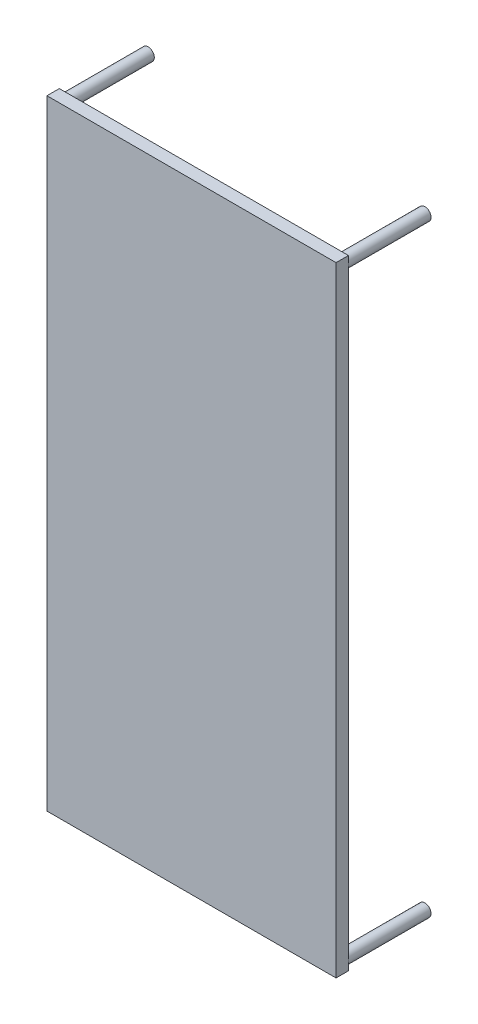
ISO-10303-21;
HEADER;
FILE_DESCRIPTION(('STEP AP214'),'2;1');
FILE_NAME('part.step','',(''),(''),'','','');
FILE_SCHEMA(('AUTOMOTIVE_DESIGN { 1 0 10303 214 1 1 1 1 }'));
ENDSEC;
DATA;
#1=APPLICATION_CONTEXT('core data for automotive mechanical design processes');
#2=APPLICATION_PROTOCOL_DEFINITION('international standard','automotive_design',2000,#1);
#3=PRODUCT_CONTEXT('',#1,'mechanical');
#4=PRODUCT('Part','Part','',(#3));
#5=PRODUCT_RELATED_PRODUCT_CATEGORY('part','',(#4));
#6=PRODUCT_DEFINITION_FORMATION('','',#4);
#7=PRODUCT_DEFINITION_CONTEXT('part definition',#1,'design');
#8=PRODUCT_DEFINITION('design','',#6,#7);
#9=PRODUCT_DEFINITION_SHAPE('','',#8);
#10=(LENGTH_UNIT() NAMED_UNIT(*) SI_UNIT(.MILLI.,.METRE.));
#11=(NAMED_UNIT(*) PLANE_ANGLE_UNIT() SI_UNIT($,.RADIAN.));
#12=(NAMED_UNIT(*) SI_UNIT($,.STERADIAN.) SOLID_ANGLE_UNIT());
#13=UNCERTAINTY_MEASURE_WITH_UNIT(LENGTH_MEASURE(1.E-05),#10,'distance_accuracy_value','');
#14=(GEOMETRIC_REPRESENTATION_CONTEXT(3) GLOBAL_UNCERTAINTY_ASSIGNED_CONTEXT((#13)) GLOBAL_UNIT_ASSIGNED_CONTEXT((#10,
#11,#12)) REPRESENTATION_CONTEXT('',''));
#15=CARTESIAN_POINT('',(0.,0.,0.));
#16=DIRECTION('',(0.,0.,1.));
#17=DIRECTION('',(1.,0.,0.));
#18=AXIS2_PLACEMENT_3D('',#15,#16,#17);
#19=CARTESIAN_POINT('',(33.5,148.,20.));
#20=DIRECTION('',(0.,0.,-1.));
#21=DIRECTION('',(-1.,0.,0.));
#22=AXIS2_PLACEMENT_3D('',#19,#20,#21);
#23=CYLINDRICAL_SURFACE('',#22,1.5);
#24=CARTESIAN_POINT('',(33.5,148.,20.));
#25=DIRECTION('',(0.,0.,1.));
#26=DIRECTION('',(1.,0.,0.));
#27=AXIS2_PLACEMENT_3D('',#24,#25,#26);
#28=CIRCLE('',#27,1.5);
#29=CARTESIAN_POINT('',(35.,148.,20.));
#30=VERTEX_POINT('',#29);
#31=EDGE_CURVE('E11',#30,#30,#28,.T.);
#32=ORIENTED_EDGE('',*,*,#31,.F.);
#33=EDGE_LOOP('',(#32));
#34=FACE_BOUND('',#33,.T.);
#35=CARTESIAN_POINT('',(33.5,148.,0.));
#36=DIRECTION('',(0.,0.,1.));
#37=DIRECTION('',(1.,0.,0.));
#38=AXIS2_PLACEMENT_3D('',#35,#36,#37);
#39=CIRCLE('',#38,1.5);
#40=CARTESIAN_POINT('',(35.,148.,0.));
#41=VERTEX_POINT('',#40);
#42=EDGE_CURVE('E36',#41,#41,#39,.T.);
#43=ORIENTED_EDGE('',*,*,#42,.T.);
#44=EDGE_LOOP('',(#43));
#45=FACE_BOUND('',#44,.T.);
#46=ADVANCED_FACE('F33',(#34,#45),#23,.T.);
#47=CARTESIAN_POINT('',(33.5,148.,0.));
#48=DIRECTION('',(0.,0.,1.));
#49=DIRECTION('',(1.,0.,0.));
#50=AXIS2_PLACEMENT_3D('',#47,#48,#49);
#51=PLANE('',#50);
#52=ORIENTED_EDGE('',*,*,#42,.F.);
#53=EDGE_LOOP('',(#52));
#54=FACE_BOUND('',#53,.T.);
#55=ADVANCED_FACE('F129',(#54),#51,.F.);
#56=CARTESIAN_POINT('',(0.,0.,20.));
#57=DIRECTION('',(0.,0.,1.));
#58=DIRECTION('',(1.,0.,0.));
#59=AXIS2_PLACEMENT_3D('',#56,#57,#58);
#60=PLANE('',#59);
#61=DIRECTION('',(0.,-1.,0.));
#62=VECTOR('',#61,1.);
#63=CARTESIAN_POINT('',(-35.,0.,20.));
#64=LINE('',#63,#62);
#65=CARTESIAN_POINT('',(-35.,2.,20.));
#66=VERTEX_POINT('',#65);
#67=CARTESIAN_POINT('',(-35.,0.,20.));
#68=VERTEX_POINT('',#67);
#69=EDGE_CURVE('E98',#66,#68,#64,.T.);
#70=ORIENTED_EDGE('',*,*,#69,.F.);
#71=CARTESIAN_POINT('',(-33.5,2.,20.));
#72=DIRECTION('',(0.,0.,1.));
#73=DIRECTION('',(1.,0.,0.));
#74=AXIS2_PLACEMENT_3D('',#71,#72,#73);
#75=CIRCLE('',#74,1.5);
#76=EDGE_CURVE('E108',#66,#66,#75,.T.);
#77=ORIENTED_EDGE('',*,*,#76,.T.);
#78=CARTESIAN_POINT('',(-35.,148.,20.));
#79=VERTEX_POINT('',#78);
#80=EDGE_CURVE('E94',#79,#66,#64,.T.);
#81=ORIENTED_EDGE('',*,*,#80,.F.);
#82=CARTESIAN_POINT('',(-33.5,148.,20.));
#83=DIRECTION('',(0.,0.,1.));
#84=DIRECTION('',(1.,0.,0.));
#85=AXIS2_PLACEMENT_3D('',#82,#83,#84);
#86=CIRCLE('',#85,1.5);
#87=EDGE_CURVE('E191',#79,#79,#86,.T.);
#88=ORIENTED_EDGE('',*,*,#87,.T.);
#89=CARTESIAN_POINT('',(-35.,150.,20.));
#90=VERTEX_POINT('',#89);
#91=EDGE_CURVE('E101',#90,#79,#64,.T.);
#92=ORIENTED_EDGE('',*,*,#91,.F.);
#93=DIRECTION('',(-1.,0.,0.));
#94=VECTOR('',#93,1.);
#95=CARTESIAN_POINT('',(35.,150.,20.));
#96=LINE('',#95,#94);
#97=CARTESIAN_POINT('',(35.,150.,20.));
#98=VERTEX_POINT('',#97);
#99=EDGE_CURVE('E110',#98,#90,#96,.T.);
#100=ORIENTED_EDGE('',*,*,#99,.F.);
#101=DIRECTION('',(0.,1.,0.));
#102=VECTOR('',#101,1.);
#103=CARTESIAN_POINT('',(35.,0.,20.));
#104=LINE('',#103,#102);
#105=EDGE_CURVE('E193',#30,#98,#104,.T.);
#106=ORIENTED_EDGE('',*,*,#105,.F.);
#107=ORIENTED_EDGE('',*,*,#31,.T.);
#108=CARTESIAN_POINT('',(35.,2.,20.));
#109=VERTEX_POINT('',#108);
#110=EDGE_CURVE('E47',#109,#30,#104,.T.);
#111=ORIENTED_EDGE('',*,*,#110,.F.);
#112=CARTESIAN_POINT('',(33.5,2.,20.));
#113=DIRECTION('',(0.,0.,1.));
#114=DIRECTION('',(1.,0.,0.));
#115=AXIS2_PLACEMENT_3D('',#112,#113,#114);
#116=CIRCLE('',#115,1.5);
#117=EDGE_CURVE('E185',#109,#109,#116,.T.);
#118=ORIENTED_EDGE('',*,*,#117,.T.);
#119=CARTESIAN_POINT('',(35.,0.,20.));
#120=VERTEX_POINT('',#119);
#121=EDGE_CURVE('E111',#120,#109,#104,.T.);
#122=ORIENTED_EDGE('',*,*,#121,.F.);
#123=DIRECTION('',(1.,0.,0.));
#124=VECTOR('',#123,1.);
#125=CARTESIAN_POINT('',(35.,0.,20.));
#126=LINE('',#125,#124);
#127=EDGE_CURVE('E76',#68,#120,#126,.T.);
#128=ORIENTED_EDGE('',*,*,#127,.F.);
#129=EDGE_LOOP('',(#70,#77,#81,#88,#92,#100,#106,#107,#111,#118,#122,#128));
#130=FACE_BOUND('',#129,.T.);
#131=ADVANCED_FACE('F106',(#130),#60,.F.);
#132=CARTESIAN_POINT('',(35.,0.,23.));
#133=DIRECTION('',(-1.,0.,0.));
#134=DIRECTION('',(0.,0.,1.));
#135=AXIS2_PLACEMENT_3D('',#132,#133,#134);
#136=PLANE('',#135);
#137=ORIENTED_EDGE('',*,*,#121,.T.);
#138=ORIENTED_EDGE('',*,*,#110,.T.);
#139=ORIENTED_EDGE('',*,*,#105,.T.);
#140=DIRECTION('',(0.,0.,-1.));
#141=VECTOR('',#140,1.);
#142=CARTESIAN_POINT('',(35.,150.,23.));
#143=LINE('',#142,#141);
#144=CARTESIAN_POINT('',(35.,150.,23.));
#145=VERTEX_POINT('',#144);
#146=EDGE_CURVE('E123',#145,#98,#143,.T.);
#147=ORIENTED_EDGE('',*,*,#146,.F.);
#148=DIRECTION('',(0.,1.,0.));
#149=VECTOR('',#148,1.);
#150=CARTESIAN_POINT('',(35.,0.,23.));
#151=LINE('',#150,#149);
#152=CARTESIAN_POINT('',(35.,0.,23.));
#153=VERTEX_POINT('',#152);
#154=EDGE_CURVE('E114',#153,#145,#151,.T.);
#155=ORIENTED_EDGE('',*,*,#154,.F.);
#156=DIRECTION('',(0.,0.,-1.));
#157=VECTOR('',#156,1.);
#158=CARTESIAN_POINT('',(35.,0.,23.));
#159=LINE('',#158,#157);
#160=EDGE_CURVE('E117',#153,#120,#159,.T.);
#161=ORIENTED_EDGE('',*,*,#160,.T.);
#162=EDGE_LOOP('',(#137,#138,#139,#147,#155,#161));
#163=FACE_BOUND('',#162,.T.);
#164=ADVANCED_FACE('F135',(#163),#136,.F.);
#165=CARTESIAN_POINT('',(35.,150.,23.));
#166=DIRECTION('',(0.,-1.,0.));
#167=DIRECTION('',(0.,0.,-1.));
#168=AXIS2_PLACEMENT_3D('',#165,#166,#167);
#169=PLANE('',#168);
#170=ORIENTED_EDGE('',*,*,#99,.T.);
#171=DIRECTION('',(0.,0.,-1.));
#172=VECTOR('',#171,1.);
#173=CARTESIAN_POINT('',(-35.,150.,23.));
#174=LINE('',#173,#172);
#175=CARTESIAN_POINT('',(-35.,150.,23.));
#176=VERTEX_POINT('',#175);
#177=EDGE_CURVE('E121',#176,#90,#174,.T.);
#178=ORIENTED_EDGE('',*,*,#177,.F.);
#179=DIRECTION('',(-1.,0.,0.));
#180=VECTOR('',#179,1.);
#181=CARTESIAN_POINT('',(35.,150.,23.));
#182=LINE('',#181,#180);
#183=EDGE_CURVE('E84',#145,#176,#182,.T.);
#184=ORIENTED_EDGE('',*,*,#183,.F.);
#185=ORIENTED_EDGE('',*,*,#146,.T.);
#186=EDGE_LOOP('',(#170,#178,#184,#185));
#187=FACE_BOUND('',#186,.T.);
#188=ADVANCED_FACE('F141',(#187),#169,.F.);
#189=CARTESIAN_POINT('',(-35.,0.,23.));
#190=DIRECTION('',(1.,0.,0.));
#191=DIRECTION('',(0.,0.,-1.));
#192=AXIS2_PLACEMENT_3D('',#189,#190,#191);
#193=PLANE('',#192);
#194=ORIENTED_EDGE('',*,*,#91,.T.);
#195=ORIENTED_EDGE('',*,*,#80,.T.);
#196=ORIENTED_EDGE('',*,*,#69,.T.);
#197=DIRECTION('',(0.,0.,-1.));
#198=VECTOR('',#197,1.);
#199=CARTESIAN_POINT('',(-35.,0.,23.));
#200=LINE('',#199,#198);
#201=CARTESIAN_POINT('',(-35.,0.,23.));
#202=VERTEX_POINT('',#201);
#203=EDGE_CURVE('E119',#202,#68,#200,.T.);
#204=ORIENTED_EDGE('',*,*,#203,.F.);
#205=DIRECTION('',(0.,-1.,0.));
#206=VECTOR('',#205,1.);
#207=CARTESIAN_POINT('',(-35.,0.,23.));
#208=LINE('',#207,#206);
#209=EDGE_CURVE('E197',#176,#202,#208,.T.);
#210=ORIENTED_EDGE('',*,*,#209,.F.);
#211=ORIENTED_EDGE('',*,*,#177,.T.);
#212=EDGE_LOOP('',(#194,#195,#196,#204,#210,#211));
#213=FACE_BOUND('',#212,.T.);
#214=ADVANCED_FACE('F96',(#213),#193,.F.);
#215=CARTESIAN_POINT('',(35.,0.,23.));
#216=DIRECTION('',(0.,1.,0.));
#217=DIRECTION('',(0.,0.,1.));
#218=AXIS2_PLACEMENT_3D('',#215,#216,#217);
#219=PLANE('',#218);
#220=ORIENTED_EDGE('',*,*,#127,.T.);
#221=ORIENTED_EDGE('',*,*,#160,.F.);
#222=DIRECTION('',(1.,0.,0.));
#223=VECTOR('',#222,1.);
#224=CARTESIAN_POINT('',(35.,0.,23.));
#225=LINE('',#224,#223);
#226=EDGE_CURVE('E56',#202,#153,#225,.T.);
#227=ORIENTED_EDGE('',*,*,#226,.F.);
#228=ORIENTED_EDGE('',*,*,#203,.T.);
#229=EDGE_LOOP('',(#220,#221,#227,#228));
#230=FACE_BOUND('',#229,.T.);
#231=ADVANCED_FACE('F146',(#230),#219,.F.);
#232=CARTESIAN_POINT('',(0.,0.,23.));
#233=DIRECTION('',(0.,0.,1.));
#234=DIRECTION('',(1.,0.,0.));
#235=AXIS2_PLACEMENT_3D('',#232,#233,#234);
#236=PLANE('',#235);
#237=ORIENTED_EDGE('',*,*,#154,.T.);
#238=ORIENTED_EDGE('',*,*,#183,.T.);
#239=ORIENTED_EDGE('',*,*,#209,.T.);
#240=ORIENTED_EDGE('',*,*,#226,.T.);
#241=EDGE_LOOP('',(#237,#238,#239,#240));
#242=FACE_BOUND('',#241,.T.);
#243=ADVANCED_FACE('F148',(#242),#236,.T.);
#244=CARTESIAN_POINT('',(-33.5,148.,20.));
#245=DIRECTION('',(0.,0.,-1.));
#246=DIRECTION('',(-1.,0.,0.));
#247=AXIS2_PLACEMENT_3D('',#244,#245,#246);
#248=CYLINDRICAL_SURFACE('',#247,1.5);
#249=ORIENTED_EDGE('',*,*,#87,.F.);
#250=EDGE_LOOP('',(#249));
#251=FACE_BOUND('',#250,.T.);
#252=CARTESIAN_POINT('',(-33.5,148.,0.));
#253=DIRECTION('',(0.,0.,1.));
#254=DIRECTION('',(1.,0.,0.));
#255=AXIS2_PLACEMENT_3D('',#252,#253,#254);
#256=CIRCLE('',#255,1.5);
#257=CARTESIAN_POINT('',(-32.,148.,0.));
#258=VERTEX_POINT('',#257);
#259=EDGE_CURVE('E188',#258,#258,#256,.T.);
#260=ORIENTED_EDGE('',*,*,#259,.T.);
#261=EDGE_LOOP('',(#260));
#262=FACE_BOUND('',#261,.T.);
#263=ADVANCED_FACE('F152',(#251,#262),#248,.T.);
#264=CARTESIAN_POINT('',(-33.5,148.,0.));
#265=DIRECTION('',(0.,0.,1.));
#266=DIRECTION('',(1.,0.,0.));
#267=AXIS2_PLACEMENT_3D('',#264,#265,#266);
#268=PLANE('',#267);
#269=ORIENTED_EDGE('',*,*,#259,.F.);
#270=EDGE_LOOP('',(#269));
#271=FACE_BOUND('',#270,.T.);
#272=ADVANCED_FACE('F155',(#271),#268,.F.);
#273=CARTESIAN_POINT('',(33.5,2.,20.));
#274=DIRECTION('',(0.,0.,-1.));
#275=DIRECTION('',(-1.,0.,0.));
#276=AXIS2_PLACEMENT_3D('',#273,#274,#275);
#277=CYLINDRICAL_SURFACE('',#276,1.5);
#278=ORIENTED_EDGE('',*,*,#117,.F.);
#279=EDGE_LOOP('',(#278));
#280=FACE_BOUND('',#279,.T.);
#281=CARTESIAN_POINT('',(33.5,2.,0.));
#282=DIRECTION('',(0.,0.,1.));
#283=DIRECTION('',(1.,0.,0.));
#284=AXIS2_PLACEMENT_3D('',#281,#282,#283);
#285=CIRCLE('',#284,1.5);
#286=CARTESIAN_POINT('',(35.,2.,0.));
#287=VERTEX_POINT('',#286);
#288=EDGE_CURVE('E182',#287,#287,#285,.T.);
#289=ORIENTED_EDGE('',*,*,#288,.T.);
#290=EDGE_LOOP('',(#289));
#291=FACE_BOUND('',#290,.T.);
#292=ADVANCED_FACE('F159',(#280,#291),#277,.T.);
#293=CARTESIAN_POINT('',(33.5,2.,0.));
#294=DIRECTION('',(0.,0.,1.));
#295=DIRECTION('',(1.,0.,0.));
#296=AXIS2_PLACEMENT_3D('',#293,#294,#295);
#297=PLANE('',#296);
#298=ORIENTED_EDGE('',*,*,#288,.F.);
#299=EDGE_LOOP('',(#298));
#300=FACE_BOUND('',#299,.T.);
#301=ADVANCED_FACE('F163',(#300),#297,.F.);
#302=CARTESIAN_POINT('',(-33.5,2.,20.));
#303=DIRECTION('',(0.,0.,-1.));
#304=DIRECTION('',(-1.,0.,0.));
#305=AXIS2_PLACEMENT_3D('',#302,#303,#304);
#306=CYLINDRICAL_SURFACE('',#305,1.5);
#307=ORIENTED_EDGE('',*,*,#76,.F.);
#308=EDGE_LOOP('',(#307));
#309=FACE_BOUND('',#308,.T.);
#310=CARTESIAN_POINT('',(-33.5,2.,0.));
#311=DIRECTION('',(0.,0.,1.));
#312=DIRECTION('',(1.,0.,0.));
#313=AXIS2_PLACEMENT_3D('',#310,#311,#312);
#314=CIRCLE('',#313,1.5);
#315=CARTESIAN_POINT('',(-32.,2.,0.));
#316=VERTEX_POINT('',#315);
#317=EDGE_CURVE('E179',#316,#316,#314,.T.);
#318=ORIENTED_EDGE('',*,*,#317,.T.);
#319=EDGE_LOOP('',(#318));
#320=FACE_BOUND('',#319,.T.);
#321=ADVANCED_FACE('F167',(#309,#320),#306,.T.);
#322=CARTESIAN_POINT('',(-33.5,2.,0.));
#323=DIRECTION('',(0.,0.,1.));
#324=DIRECTION('',(1.,0.,0.));
#325=AXIS2_PLACEMENT_3D('',#322,#323,#324);
#326=PLANE('',#325);
#327=ORIENTED_EDGE('',*,*,#317,.F.);
#328=EDGE_LOOP('',(#327));
#329=FACE_BOUND('',#328,.T.);
#330=ADVANCED_FACE('F171',(#329),#326,.F.);
#331=CLOSED_SHELL('',(#46,#55,#131,#164,#188,#214,#231,#243,#263,#272,#292,#301,#321,#330));
#332=MANIFOLD_SOLID_BREP('B2',#331);
#333=ADVANCED_BREP_SHAPE_REPRESENTATION('',(#18,#332),#14);
#334=SHAPE_DEFINITION_REPRESENTATION(#9,#333);
ENDSEC;
END-ISO-10303-21;
